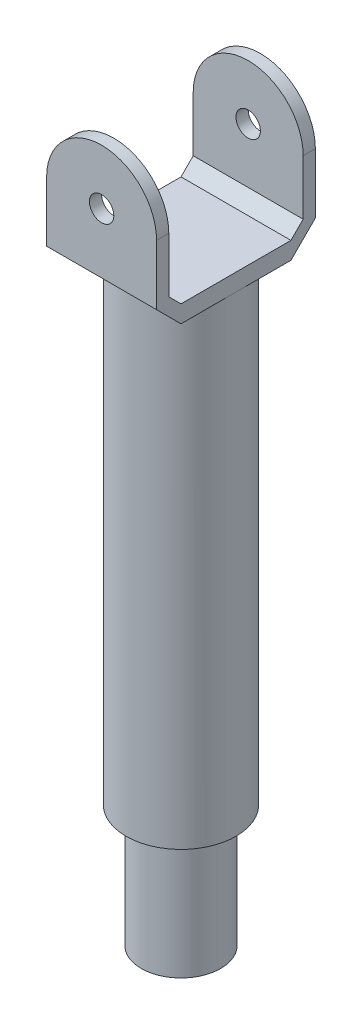
ISO-10303-21;
HEADER;
FILE_DESCRIPTION(('STEP AP214'),'2;1');
FILE_NAME('part.step','',(''),(''),'','','');
FILE_SCHEMA(('AUTOMOTIVE_DESIGN { 1 0 10303 214 1 1 1 1 }'));
ENDSEC;
DATA;
#1=APPLICATION_CONTEXT('core data for automotive mechanical design processes');
#2=APPLICATION_PROTOCOL_DEFINITION('international standard','automotive_design',2000,#1);
#3=PRODUCT_CONTEXT('',#1,'mechanical');
#4=PRODUCT('Part','Part','',(#3));
#5=PRODUCT_RELATED_PRODUCT_CATEGORY('part','',(#4));
#6=PRODUCT_DEFINITION_FORMATION('','',#4);
#7=PRODUCT_DEFINITION_CONTEXT('part definition',#1,'design');
#8=PRODUCT_DEFINITION('design','',#6,#7);
#9=PRODUCT_DEFINITION_SHAPE('','',#8);
#10=(LENGTH_UNIT() NAMED_UNIT(*) SI_UNIT(.MILLI.,.METRE.));
#11=(NAMED_UNIT(*) PLANE_ANGLE_UNIT() SI_UNIT($,.RADIAN.));
#12=(NAMED_UNIT(*) SI_UNIT($,.STERADIAN.) SOLID_ANGLE_UNIT());
#13=UNCERTAINTY_MEASURE_WITH_UNIT(LENGTH_MEASURE(1.E-05),#10,'distance_accuracy_value','');
#14=(GEOMETRIC_REPRESENTATION_CONTEXT(3) GLOBAL_UNCERTAINTY_ASSIGNED_CONTEXT((#13)) GLOBAL_UNIT_ASSIGNED_CONTEXT((#10,
#11,#12)) REPRESENTATION_CONTEXT('',''));
#15=CARTESIAN_POINT('',(0.,0.,0.));
#16=DIRECTION('',(0.,0.,1.));
#17=DIRECTION('',(1.,0.,0.));
#18=AXIS2_PLACEMENT_3D('',#15,#16,#17);
#19=CARTESIAN_POINT('',(45.,0.,0.));
#20=DIRECTION('',(-1.,0.,0.));
#21=DIRECTION('',(0.,0.,1.));
#22=AXIS2_PLACEMENT_3D('',#19,#20,#21);
#23=PLANE('',#22);
#24=DIRECTION('',(0.,0.,1.));
#25=VECTOR('',#24,1.);
#26=CARTESIAN_POINT('',(45.,555.,-64.9999999999999));
#27=LINE('',#26,#25);
#28=CARTESIAN_POINT('',(45.,555.,55.));
#29=VERTEX_POINT('',#28);
#30=CARTESIAN_POINT('',(45.,555.,64.9999999999998));
#31=VERTEX_POINT('',#30);
#32=EDGE_CURVE('E273',#29,#31,#27,.T.);
#33=ORIENTED_EDGE('',*,*,#32,.T.);
#34=DIRECTION('',(0.,-1.,0.));
#35=VECTOR('',#34,1.);
#36=CARTESIAN_POINT('',(45.,600.,65.));
#37=LINE('',#36,#35);
#38=CARTESIAN_POINT('',(45.,505.857864376269,65.));
#39=VERTEX_POINT('',#38);
#40=EDGE_CURVE('E43',#31,#39,#37,.T.);
#41=ORIENTED_EDGE('',*,*,#40,.T.);
#42=DIRECTION('',(0.,-0.707106781186543,-0.707106781186552));
#43=VECTOR('',#42,1.);
#44=CARTESIAN_POINT('',(45.,505.857864376269,65.));
#45=LINE('',#44,#43);
#46=CARTESIAN_POINT('',(45.,485.857864376269,45.));
#47=VERTEX_POINT('',#46);
#48=EDGE_CURVE('E326',#39,#47,#45,.T.);
#49=ORIENTED_EDGE('',*,*,#48,.T.);
#50=DIRECTION('',(0.,0.,-1.));
#51=VECTOR('',#50,1.);
#52=CARTESIAN_POINT('',(45.,485.857864376269,45.));
#53=LINE('',#52,#51);
#54=CARTESIAN_POINT('',(45.,485.857864376269,0.));
#55=VERTEX_POINT('',#54);
#56=EDGE_CURVE('E334',#47,#55,#53,.T.);
#57=ORIENTED_EDGE('',*,*,#56,.T.);
#58=CARTESIAN_POINT('',(45.,485.857864376269,-45.));
#59=VERTEX_POINT('',#58);
#60=EDGE_CURVE('E333',#55,#59,#53,.T.);
#61=ORIENTED_EDGE('',*,*,#60,.T.);
#62=DIRECTION('',(0.,0.707106781186548,-0.707106781186546));
#63=VECTOR('',#62,1.);
#64=CARTESIAN_POINT('',(45.,485.857864376269,-45.));
#65=LINE('',#64,#63);
#66=CARTESIAN_POINT('',(45.,505.857864376269,-64.9999999999999));
#67=VERTEX_POINT('',#66);
#68=EDGE_CURVE('E301',#59,#67,#65,.T.);
#69=ORIENTED_EDGE('',*,*,#68,.T.);
#70=DIRECTION('',(0.,1.,0.));
#71=VECTOR('',#70,1.);
#72=CARTESIAN_POINT('',(45.,505.857864376269,-64.9999999999999));
#73=LINE('',#72,#71);
#74=CARTESIAN_POINT('',(45.,555.,-64.9999999999999));
#75=VERTEX_POINT('',#74);
#76=EDGE_CURVE('E290',#67,#75,#73,.T.);
#77=ORIENTED_EDGE('',*,*,#76,.T.);
#78=CARTESIAN_POINT('',(45.,555.,-55.));
#79=VERTEX_POINT('',#78);
#80=EDGE_CURVE('E152',#75,#79,#27,.T.);
#81=ORIENTED_EDGE('',*,*,#80,.T.);
#82=DIRECTION('',(0.,-1.,0.));
#83=VECTOR('',#82,1.);
#84=CARTESIAN_POINT('',(45.,600.,-55.));
#85=LINE('',#84,#83);
#86=CARTESIAN_POINT('',(45.,510.,-55.));
#87=VERTEX_POINT('',#86);
#88=EDGE_CURVE('E287',#79,#87,#85,.T.);
#89=ORIENTED_EDGE('',*,*,#88,.T.);
#90=DIRECTION('',(0.,-0.707106781186549,0.707106781186546));
#91=VECTOR('',#90,1.);
#92=CARTESIAN_POINT('',(45.,510.,-55.));
#93=LINE('',#92,#91);
#94=CARTESIAN_POINT('',(45.,500.,-45.));
#95=VERTEX_POINT('',#94);
#96=EDGE_CURVE('E204',#87,#95,#93,.T.);
#97=ORIENTED_EDGE('',*,*,#96,.T.);
#98=DIRECTION('',(0.,0.,1.));
#99=VECTOR('',#98,1.);
#100=CARTESIAN_POINT('',(45.,500.,-45.));
#101=LINE('',#100,#99);
#102=CARTESIAN_POINT('',(45.,500.,45.));
#103=VERTEX_POINT('',#102);
#104=EDGE_CURVE('E199',#95,#103,#101,.T.);
#105=ORIENTED_EDGE('',*,*,#104,.T.);
#106=DIRECTION('',(0.,0.707106781186548,0.707106781186547));
#107=VECTOR('',#106,1.);
#108=CARTESIAN_POINT('',(45.,500.,45.));
#109=LINE('',#108,#107);
#110=CARTESIAN_POINT('',(45.,510.,55.));
#111=VERTEX_POINT('',#110);
#112=EDGE_CURVE('E322',#103,#111,#109,.T.);
#113=ORIENTED_EDGE('',*,*,#112,.T.);
#114=DIRECTION('',(0.,1.,0.));
#115=VECTOR('',#114,1.);
#116=CARTESIAN_POINT('',(45.,510.,55.));
#117=LINE('',#116,#115);
#118=EDGE_CURVE('E320',#111,#29,#117,.T.);
#119=ORIENTED_EDGE('',*,*,#118,.T.);
#120=EDGE_LOOP('',(#33,#41,#49,#57,#61,#69,#77,#81,#89,#97,#105,#113,#119));
#121=FACE_BOUND('',#120,.T.);
#122=ADVANCED_FACE('F39',(#121),#23,.F.);
#123=CARTESIAN_POINT('',(-45.,0.,0.));
#124=DIRECTION('',(-1.,0.,0.));
#125=DIRECTION('',(0.,0.,1.));
#126=AXIS2_PLACEMENT_3D('',#123,#124,#125);
#127=PLANE('',#126);
#128=DIRECTION('',(0.,-1.,0.));
#129=VECTOR('',#128,1.);
#130=CARTESIAN_POINT('',(-45.,600.,65.));
#131=LINE('',#130,#129);
#132=CARTESIAN_POINT('',(-45.,555.,65.0000059999998));
#133=VERTEX_POINT('',#132);
#134=CARTESIAN_POINT('',(-45.,505.857864376269,65.));
#135=VERTEX_POINT('',#134);
#136=EDGE_CURVE('E158',#133,#135,#131,.T.);
#137=ORIENTED_EDGE('',*,*,#136,.F.);
#138=DIRECTION('',(0.,0.,1.));
#139=VECTOR('',#138,1.);
#140=CARTESIAN_POINT('',(-45.,555.,-64.9999999999999));
#141=LINE('',#140,#139);
#142=CARTESIAN_POINT('',(-45.,555.,55.));
#143=VERTEX_POINT('',#142);
#144=EDGE_CURVE('E139',#143,#133,#141,.T.);
#145=ORIENTED_EDGE('',*,*,#144,.F.);
#146=DIRECTION('',(0.,1.,0.));
#147=VECTOR('',#146,1.);
#148=CARTESIAN_POINT('',(-45.,510.,55.));
#149=LINE('',#148,#147);
#150=CARTESIAN_POINT('',(-45.,510.,55.));
#151=VERTEX_POINT('',#150);
#152=EDGE_CURVE('E169',#151,#143,#149,.T.);
#153=ORIENTED_EDGE('',*,*,#152,.F.);
#154=DIRECTION('',(0.,0.707106781186548,0.707106781186547));
#155=VECTOR('',#154,1.);
#156=CARTESIAN_POINT('',(-45.,500.,45.));
#157=LINE('',#156,#155);
#158=CARTESIAN_POINT('',(-45.,500.,45.));
#159=VERTEX_POINT('',#158);
#160=EDGE_CURVE('E174',#159,#151,#157,.T.);
#161=ORIENTED_EDGE('',*,*,#160,.F.);
#162=DIRECTION('',(0.,0.,1.));
#163=VECTOR('',#162,1.);
#164=CARTESIAN_POINT('',(-45.,500.,-45.));
#165=LINE('',#164,#163);
#166=CARTESIAN_POINT('',(-45.,500.,-45.));
#167=VERTEX_POINT('',#166);
#168=EDGE_CURVE('E305',#167,#159,#165,.T.);
#169=ORIENTED_EDGE('',*,*,#168,.F.);
#170=DIRECTION('',(0.,-0.707106781186549,0.707106781186546));
#171=VECTOR('',#170,1.);
#172=CARTESIAN_POINT('',(-45.,510.,-55.));
#173=LINE('',#172,#171);
#174=CARTESIAN_POINT('',(-45.,510.,-55.));
#175=VERTEX_POINT('',#174);
#176=EDGE_CURVE('E195',#175,#167,#173,.T.);
#177=ORIENTED_EDGE('',*,*,#176,.F.);
#178=DIRECTION('',(0.,-1.,0.));
#179=VECTOR('',#178,1.);
#180=CARTESIAN_POINT('',(-45.,600.,-55.));
#181=LINE('',#180,#179);
#182=CARTESIAN_POINT('',(-45.,555.,-55.));
#183=VERTEX_POINT('',#182);
#184=EDGE_CURVE('E192',#183,#175,#181,.T.);
#185=ORIENTED_EDGE('',*,*,#184,.F.);
#186=CARTESIAN_POINT('',(-45.,555.,-64.9999999999999));
#187=VERTEX_POINT('',#186);
#188=EDGE_CURVE('E151',#187,#183,#141,.T.);
#189=ORIENTED_EDGE('',*,*,#188,.F.);
#190=DIRECTION('',(0.,1.,0.));
#191=VECTOR('',#190,1.);
#192=CARTESIAN_POINT('',(-45.,505.857864376269,-64.9999999999999));
#193=LINE('',#192,#191);
#194=CARTESIAN_POINT('',(-45.,505.857864376269,-64.9999999999999));
#195=VERTEX_POINT('',#194);
#196=EDGE_CURVE('E188',#195,#187,#193,.T.);
#197=ORIENTED_EDGE('',*,*,#196,.F.);
#198=DIRECTION('',(0.,0.707106781186548,-0.707106781186546));
#199=VECTOR('',#198,1.);
#200=CARTESIAN_POINT('',(-45.,485.857864376269,-45.));
#201=LINE('',#200,#199);
#202=CARTESIAN_POINT('',(-45.,485.857864376269,-45.));
#203=VERTEX_POINT('',#202);
#204=EDGE_CURVE('E185',#203,#195,#201,.T.);
#205=ORIENTED_EDGE('',*,*,#204,.F.);
#206=DIRECTION('',(0.,0.,-1.));
#207=VECTOR('',#206,1.);
#208=CARTESIAN_POINT('',(-45.,485.857864376269,45.));
#209=LINE('',#208,#207);
#210=CARTESIAN_POINT('',(-45.,485.857864376269,0.));
#211=VERTEX_POINT('',#210);
#212=EDGE_CURVE('E172',#211,#203,#209,.T.);
#213=ORIENTED_EDGE('',*,*,#212,.F.);
#214=CARTESIAN_POINT('',(-45.,485.857864376269,45.));
#215=VERTEX_POINT('',#214);
#216=EDGE_CURVE('E181',#215,#211,#209,.T.);
#217=ORIENTED_EDGE('',*,*,#216,.F.);
#218=DIRECTION('',(0.,-0.707106781186543,-0.707106781186552));
#219=VECTOR('',#218,1.);
#220=CARTESIAN_POINT('',(-45.,505.857864376269,65.));
#221=LINE('',#220,#219);
#222=EDGE_CURVE('E167',#135,#215,#221,.T.);
#223=ORIENTED_EDGE('',*,*,#222,.F.);
#224=EDGE_LOOP('',(#137,#145,#153,#161,#169,#177,#185,#189,#197,#205,#213,#217,#223));
#225=FACE_BOUND('',#224,.T.);
#226=ADVANCED_FACE('F164',(#225),#127,.T.);
#227=CARTESIAN_POINT('',(0.,500.,0.));
#228=DIRECTION('',(0.,-1.,0.));
#229=DIRECTION('',(0.,0.,-1.));
#230=AXIS2_PLACEMENT_3D('',#227,#228,#229);
#231=CYLINDRICAL_SURFACE('',#230,45.);
#232=CARTESIAN_POINT('',(0.,100.,0.));
#233=DIRECTION('',(0.,1.,0.));
#234=DIRECTION('',(0.,0.,1.));
#235=AXIS2_PLACEMENT_3D('',#232,#233,#234);
#236=CIRCLE('',#235,45.);
#237=CARTESIAN_POINT('',(0.,100.,45.));
#238=VERTEX_POINT('',#237);
#239=EDGE_CURVE('E232',#238,#238,#236,.T.);
#240=ORIENTED_EDGE('',*,*,#239,.T.);
#241=EDGE_LOOP('',(#240));
#242=FACE_BOUND('',#241,.T.);
#243=CARTESIAN_POINT('',(0.,485.857864376269,0.));
#244=DIRECTION('',(0.,1.,0.));
#245=DIRECTION('',(0.,0.,1.));
#246=AXIS2_PLACEMENT_3D('',#243,#244,#245);
#247=CIRCLE('',#246,45.);
#248=CARTESIAN_POINT('',(0.,485.857864376269,-45.));
#249=VERTEX_POINT('',#248);
#250=EDGE_CURVE('E50',#55,#249,#247,.T.);
#251=ORIENTED_EDGE('',*,*,#250,.F.);
#252=CARTESIAN_POINT('',(0.,485.857864376269,45.));
#253=VERTEX_POINT('',#252);
#254=EDGE_CURVE('E247',#253,#55,#247,.T.);
#255=ORIENTED_EDGE('',*,*,#254,.F.);
#256=EDGE_CURVE('E241',#211,#253,#247,.T.);
#257=ORIENTED_EDGE('',*,*,#256,.F.);
#258=EDGE_CURVE('E58',#249,#211,#247,.T.);
#259=ORIENTED_EDGE('',*,*,#258,.F.);
#260=EDGE_LOOP('',(#251,#255,#257,#259));
#261=FACE_BOUND('',#260,.T.);
#262=ADVANCED_FACE('F378',(#242,#261),#231,.T.);
#263=CARTESIAN_POINT('',(0.,100.,0.));
#264=DIRECTION('',(0.,-1.,0.));
#265=DIRECTION('',(0.,0.,-1.));
#266=AXIS2_PLACEMENT_3D('',#263,#264,#265);
#267=CYLINDRICAL_SURFACE('',#266,32.5);
#268=CARTESIAN_POINT('',(0.,100.,0.));
#269=DIRECTION('',(0.,1.,0.));
#270=DIRECTION('',(0.,0.,1.));
#271=AXIS2_PLACEMENT_3D('',#268,#269,#270);
#272=CIRCLE('',#271,32.5);
#273=CARTESIAN_POINT('',(0.,100.,32.5));
#274=VERTEX_POINT('',#273);
#275=EDGE_CURVE('E237',#274,#274,#272,.T.);
#276=ORIENTED_EDGE('',*,*,#275,.F.);
#277=EDGE_LOOP('',(#276));
#278=FACE_BOUND('',#277,.T.);
#279=CARTESIAN_POINT('',(0.,0.,0.));
#280=DIRECTION('',(0.,1.,0.));
#281=DIRECTION('',(0.,0.,1.));
#282=AXIS2_PLACEMENT_3D('',#279,#280,#281);
#283=CIRCLE('',#282,32.5);
#284=CARTESIAN_POINT('',(0.,0.,32.5));
#285=VERTEX_POINT('',#284);
#286=EDGE_CURVE('E236',#285,#285,#283,.T.);
#287=ORIENTED_EDGE('',*,*,#286,.T.);
#288=EDGE_LOOP('',(#287));
#289=FACE_BOUND('',#288,.T.);
#290=ADVANCED_FACE('F41',(#278,#289),#267,.T.);
#291=CARTESIAN_POINT('',(0.,0.,0.));
#292=DIRECTION('',(0.,1.,0.));
#293=DIRECTION('',(0.,0.,1.));
#294=AXIS2_PLACEMENT_3D('',#291,#292,#293);
#295=PLANE('',#294);
#296=ORIENTED_EDGE('',*,*,#286,.F.);
#297=EDGE_LOOP('',(#296));
#298=FACE_BOUND('',#297,.T.);
#299=ADVANCED_FACE('F433',(#298),#295,.F.);
#300=CARTESIAN_POINT('',(0.,100.,0.));
#301=DIRECTION('',(0.,1.,0.));
#302=DIRECTION('',(0.,0.,1.));
#303=AXIS2_PLACEMENT_3D('',#300,#301,#302);
#304=PLANE('',#303);
#305=ORIENTED_EDGE('',*,*,#275,.T.);
#306=EDGE_LOOP('',(#305));
#307=FACE_BOUND('',#306,.T.);
#308=ORIENTED_EDGE('',*,*,#239,.F.);
#309=EDGE_LOOP('',(#308));
#310=FACE_BOUND('',#309,.T.);
#311=ADVANCED_FACE('F435',(#307,#310),#304,.F.);
#312=CARTESIAN_POINT('',(45.,485.857864376269,45.));
#313=DIRECTION('',(0.,1.,0.));
#314=DIRECTION('',(0.,0.,1.));
#315=AXIS2_PLACEMENT_3D('',#312,#313,#314);
#316=PLANE('',#315);
#317=DIRECTION('',(-1.,0.,0.));
#318=VECTOR('',#317,1.);
#319=CARTESIAN_POINT('',(45.,485.857864376269,45.));
#320=LINE('',#319,#318);
#321=EDGE_CURVE('E218',#47,#253,#320,.T.);
#322=ORIENTED_EDGE('',*,*,#321,.T.);
#323=ORIENTED_EDGE('',*,*,#254,.T.);
#324=ORIENTED_EDGE('',*,*,#56,.F.);
#325=EDGE_LOOP('',(#322,#323,#324));
#326=FACE_BOUND('',#325,.T.);
#327=ADVANCED_FACE('F393',(#326),#316,.F.);
#328=ORIENTED_EDGE('',*,*,#60,.F.);
#329=ORIENTED_EDGE('',*,*,#250,.T.);
#330=DIRECTION('',(-1.,0.,0.));
#331=VECTOR('',#330,1.);
#332=CARTESIAN_POINT('',(45.,485.857864376269,-45.));
#333=LINE('',#332,#331);
#334=EDGE_CURVE('E213',#59,#249,#333,.T.);
#335=ORIENTED_EDGE('',*,*,#334,.F.);
#336=EDGE_LOOP('',(#328,#329,#335));
#337=FACE_BOUND('',#336,.T.);
#338=ADVANCED_FACE('F407',(#337),#316,.F.);
#339=EDGE_CURVE('E212',#249,#203,#333,.T.);
#340=ORIENTED_EDGE('',*,*,#339,.F.);
#341=ORIENTED_EDGE('',*,*,#258,.T.);
#342=ORIENTED_EDGE('',*,*,#212,.T.);
#343=EDGE_LOOP('',(#340,#341,#342));
#344=FACE_BOUND('',#343,.T.);
#345=ADVANCED_FACE('F394',(#344),#316,.F.);
#346=CARTESIAN_POINT('',(45.,500.,45.));
#347=DIRECTION('',(0.,-0.707106781186547,0.707106781186548));
#348=DIRECTION('',(0.,-0.707106781186548,-0.707106781186547));
#349=AXIS2_PLACEMENT_3D('',#346,#347,#348);
#350=PLANE('',#349);
#351=ORIENTED_EDGE('',*,*,#160,.T.);
#352=DIRECTION('',(-1.,0.,0.));
#353=VECTOR('',#352,1.);
#354=CARTESIAN_POINT('',(45.,510.,55.));
#355=LINE('',#354,#353);
#356=EDGE_CURVE('E225',#111,#151,#355,.T.);
#357=ORIENTED_EDGE('',*,*,#356,.F.);
#358=ORIENTED_EDGE('',*,*,#112,.F.);
#359=DIRECTION('',(-1.,0.,0.));
#360=VECTOR('',#359,1.);
#361=CARTESIAN_POINT('',(45.,500.,45.));
#362=LINE('',#361,#360);
#363=EDGE_CURVE('E229',#103,#159,#362,.T.);
#364=ORIENTED_EDGE('',*,*,#363,.T.);
#365=EDGE_LOOP('',(#351,#357,#358,#364));
#366=FACE_BOUND('',#365,.T.);
#367=ADVANCED_FACE('F312',(#366),#350,.F.);
#368=CARTESIAN_POINT('',(45.,510.,55.));
#369=DIRECTION('',(0.,0.,1.));
#370=DIRECTION('',(1.,0.,0.));
#371=AXIS2_PLACEMENT_3D('',#368,#369,#370);
#372=PLANE('',#371);
#373=CARTESIAN_POINT('',(0.,555.,55.));
#374=DIRECTION('',(0.,0.,1.));
#375=DIRECTION('',(1.,0.,0.));
#376=AXIS2_PLACEMENT_3D('',#373,#374,#375);
#377=CIRCLE('',#376,10.);
#378=CARTESIAN_POINT('',(10.,555.,55.));
#379=VERTEX_POINT('',#378);
#380=EDGE_CURVE('E161',#379,#379,#377,.T.);
#381=ORIENTED_EDGE('',*,*,#380,.T.);
#382=EDGE_LOOP('',(#381));
#383=FACE_BOUND('',#382,.T.);
#384=ORIENTED_EDGE('',*,*,#152,.T.);
#385=CARTESIAN_POINT('',(0.,555.,55.));
#386=DIRECTION('',(0.,0.,1.));
#387=DIRECTION('',(1.,0.,0.));
#388=AXIS2_PLACEMENT_3D('',#385,#386,#387);
#389=CIRCLE('',#388,45.);
#390=EDGE_CURVE('E145',#143,#29,#389,.F.);
#391=ORIENTED_EDGE('',*,*,#390,.T.);
#392=ORIENTED_EDGE('',*,*,#118,.F.);
#393=ORIENTED_EDGE('',*,*,#356,.T.);
#394=EDGE_LOOP('',(#384,#391,#392,#393));
#395=FACE_BOUND('',#394,.T.);
#396=ADVANCED_FACE('F318',(#383,#395),#372,.F.);
#397=CARTESIAN_POINT('',(45.,600.,65.));
#398=DIRECTION('',(0.,0.,-1.));
#399=DIRECTION('',(0.,1.,0.));
#400=AXIS2_PLACEMENT_3D('',#397,#398,#399);
#401=PLANE('',#400);
#402=CARTESIAN_POINT('',(0.,555.,65.));
#403=DIRECTION('',(0.,0.,-1.));
#404=DIRECTION('',(0.,1.,0.));
#405=AXIS2_PLACEMENT_3D('',#402,#403,#404);
#406=CIRCLE('',#405,10.);
#407=CARTESIAN_POINT('',(10.,555.,65.));
#408=VERTEX_POINT('',#407);
#409=EDGE_CURVE('E251',#408,#408,#406,.T.);
#410=ORIENTED_EDGE('',*,*,#409,.T.);
#411=EDGE_LOOP('',(#410));
#412=FACE_BOUND('',#411,.T.);
#413=ORIENTED_EDGE('',*,*,#40,.F.);
#414=CARTESIAN_POINT('',(0.,555.,65.));
#415=DIRECTION('',(0.,0.,-1.));
#416=DIRECTION('',(0.,1.,0.));
#417=AXIS2_PLACEMENT_3D('',#414,#415,#416);
#418=CIRCLE('',#417,45.);
#419=EDGE_CURVE('E143',#31,#133,#418,.F.);
#420=ORIENTED_EDGE('',*,*,#419,.T.);
#421=ORIENTED_EDGE('',*,*,#136,.T.);
#422=DIRECTION('',(-1.,0.,0.));
#423=VECTOR('',#422,1.);
#424=CARTESIAN_POINT('',(45.,505.857864376269,65.));
#425=LINE('',#424,#423);
#426=EDGE_CURVE('E222',#39,#135,#425,.T.);
#427=ORIENTED_EDGE('',*,*,#426,.F.);
#428=EDGE_LOOP('',(#413,#420,#421,#427));
#429=FACE_BOUND('',#428,.T.);
#430=ADVANCED_FACE('F156',(#412,#429),#401,.F.);
#431=CARTESIAN_POINT('',(45.,505.857864376269,65.));
#432=DIRECTION('',(0.,0.707106781186552,-0.707106781186543));
#433=DIRECTION('',(0.,0.707106781186543,0.707106781186552));
#434=AXIS2_PLACEMENT_3D('',#431,#432,#433);
#435=PLANE('',#434);
#436=ORIENTED_EDGE('',*,*,#222,.T.);
#437=EDGE_CURVE('E217',#253,#215,#320,.T.);
#438=ORIENTED_EDGE('',*,*,#437,.F.);
#439=ORIENTED_EDGE('',*,*,#321,.F.);
#440=ORIENTED_EDGE('',*,*,#48,.F.);
#441=ORIENTED_EDGE('',*,*,#426,.T.);
#442=EDGE_LOOP('',(#436,#438,#439,#440,#441));
#443=FACE_BOUND('',#442,.T.);
#444=ADVANCED_FACE('F391',(#443),#435,.F.);
#445=ORIENTED_EDGE('',*,*,#216,.T.);
#446=ORIENTED_EDGE('',*,*,#256,.T.);
#447=ORIENTED_EDGE('',*,*,#437,.T.);
#448=EDGE_LOOP('',(#445,#446,#447));
#449=FACE_BOUND('',#448,.T.);
#450=ADVANCED_FACE('F388',(#449),#316,.F.);
#451=CARTESIAN_POINT('',(45.,485.857864376269,-45.));
#452=DIRECTION('',(0.,0.707106781186546,0.707106781186548));
#453=DIRECTION('',(0.,-0.707106781186549,0.707106781186547));
#454=AXIS2_PLACEMENT_3D('',#451,#452,#453);
#455=PLANE('',#454);
#456=ORIENTED_EDGE('',*,*,#204,.T.);
#457=DIRECTION('',(-1.,0.,0.));
#458=VECTOR('',#457,1.);
#459=CARTESIAN_POINT('',(45.,505.857864376269,-64.9999999999999));
#460=LINE('',#459,#458);
#461=EDGE_CURVE('E208',#67,#195,#460,.T.);
#462=ORIENTED_EDGE('',*,*,#461,.F.);
#463=ORIENTED_EDGE('',*,*,#68,.F.);
#464=ORIENTED_EDGE('',*,*,#334,.T.);
#465=ORIENTED_EDGE('',*,*,#339,.T.);
#466=EDGE_LOOP('',(#456,#462,#463,#464,#465));
#467=FACE_BOUND('',#466,.T.);
#468=ADVANCED_FACE('F343',(#467),#455,.F.);
#469=CARTESIAN_POINT('',(45.,505.857864376269,-64.9999999999999));
#470=DIRECTION('',(0.,0.,1.));
#471=DIRECTION('',(1.,0.,0.));
#472=AXIS2_PLACEMENT_3D('',#469,#470,#471);
#473=PLANE('',#472);
#474=CARTESIAN_POINT('',(0.,555.,-64.9999999999999));
#475=DIRECTION('',(0.,0.,1.));
#476=DIRECTION('',(1.,0.,0.));
#477=AXIS2_PLACEMENT_3D('',#474,#475,#476);
#478=CIRCLE('',#477,10.);
#479=CARTESIAN_POINT('',(10.,555.,-64.9999999999999));
#480=VERTEX_POINT('',#479);
#481=EDGE_CURVE('E252',#480,#480,#478,.T.);
#482=ORIENTED_EDGE('',*,*,#481,.T.);
#483=EDGE_LOOP('',(#482));
#484=FACE_BOUND('',#483,.T.);
#485=ORIENTED_EDGE('',*,*,#196,.T.);
#486=CARTESIAN_POINT('',(0.,555.,-64.9999999999999));
#487=DIRECTION('',(0.,0.,-1.));
#488=DIRECTION('',(1.,0.,0.));
#489=AXIS2_PLACEMENT_3D('',#486,#487,#488);
#490=CIRCLE('',#489,45.);
#491=EDGE_CURVE('E275',#187,#75,#490,.T.);
#492=ORIENTED_EDGE('',*,*,#491,.T.);
#493=ORIENTED_EDGE('',*,*,#76,.F.);
#494=ORIENTED_EDGE('',*,*,#461,.T.);
#495=EDGE_LOOP('',(#485,#492,#493,#494));
#496=FACE_BOUND('',#495,.T.);
#497=ADVANCED_FACE('F347',(#484,#496),#473,.F.);
#498=CARTESIAN_POINT('',(45.,600.,-55.));
#499=DIRECTION('',(0.,0.,-1.));
#500=DIRECTION('',(0.,1.,0.));
#501=AXIS2_PLACEMENT_3D('',#498,#499,#500);
#502=PLANE('',#501);
#503=CARTESIAN_POINT('',(0.,555.,-55.));
#504=DIRECTION('',(0.,0.,-1.));
#505=DIRECTION('',(0.,1.,0.));
#506=AXIS2_PLACEMENT_3D('',#503,#504,#505);
#507=CIRCLE('',#506,10.);
#508=CARTESIAN_POINT('',(0.,565.,-55.));
#509=VERTEX_POINT('',#508);
#510=EDGE_CURVE('E248',#509,#509,#507,.T.);
#511=ORIENTED_EDGE('',*,*,#510,.T.);
#512=EDGE_LOOP('',(#511));
#513=FACE_BOUND('',#512,.T.);
#514=CARTESIAN_POINT('',(0.,555.,-55.));
#515=DIRECTION('',(0.,0.,-1.));
#516=DIRECTION('',(0.,1.,0.));
#517=AXIS2_PLACEMENT_3D('',#514,#515,#516);
#518=CIRCLE('',#517,45.);
#519=EDGE_CURVE('E11',#79,#183,#518,.F.);
#520=ORIENTED_EDGE('',*,*,#519,.T.);
#521=ORIENTED_EDGE('',*,*,#184,.T.);
#522=DIRECTION('',(-1.,0.,0.));
#523=VECTOR('',#522,1.);
#524=CARTESIAN_POINT('',(45.,510.,-55.));
#525=LINE('',#524,#523);
#526=EDGE_CURVE('E203',#87,#175,#525,.T.);
#527=ORIENTED_EDGE('',*,*,#526,.F.);
#528=ORIENTED_EDGE('',*,*,#88,.F.);
#529=EDGE_LOOP('',(#520,#521,#527,#528));
#530=FACE_BOUND('',#529,.T.);
#531=ADVANCED_FACE('F294',(#513,#530),#502,.F.);
#532=CARTESIAN_POINT('',(45.,510.,-55.));
#533=DIRECTION('',(0.,-0.707106781186546,-0.707106781186549));
#534=DIRECTION('',(0.,0.707106781186549,-0.707106781186546));
#535=AXIS2_PLACEMENT_3D('',#532,#533,#534);
#536=PLANE('',#535);
#537=ORIENTED_EDGE('',*,*,#176,.T.);
#538=DIRECTION('',(-1.,0.,0.));
#539=VECTOR('',#538,1.);
#540=CARTESIAN_POINT('',(45.,500.,-45.));
#541=LINE('',#540,#539);
#542=EDGE_CURVE('E200',#95,#167,#541,.T.);
#543=ORIENTED_EDGE('',*,*,#542,.F.);
#544=ORIENTED_EDGE('',*,*,#96,.F.);
#545=ORIENTED_EDGE('',*,*,#526,.T.);
#546=EDGE_LOOP('',(#537,#543,#544,#545));
#547=FACE_BOUND('',#546,.T.);
#548=ADVANCED_FACE('F354',(#547),#536,.F.);
#549=CARTESIAN_POINT('',(0.,500.,0.));
#550=DIRECTION('',(0.,1.,0.));
#551=DIRECTION('',(0.,0.,1.));
#552=AXIS2_PLACEMENT_3D('',#549,#550,#551);
#553=PLANE('',#552);
#554=ORIENTED_EDGE('',*,*,#168,.T.);
#555=ORIENTED_EDGE('',*,*,#363,.F.);
#556=ORIENTED_EDGE('',*,*,#104,.F.);
#557=ORIENTED_EDGE('',*,*,#542,.T.);
#558=EDGE_LOOP('',(#554,#555,#556,#557));
#559=FACE_BOUND('',#558,.T.);
#560=ADVANCED_FACE('F359',(#559),#553,.T.);
#561=CARTESIAN_POINT('',(0.,555.,-64.9999999999999));
#562=DIRECTION('',(0.,0.,1.));
#563=DIRECTION('',(1.,0.,0.));
#564=AXIS2_PLACEMENT_3D('',#561,#562,#563);
#565=CYLINDRICAL_SURFACE('',#564,10.);
#566=ORIENTED_EDGE('',*,*,#481,.F.);
#567=EDGE_LOOP('',(#566));
#568=FACE_BOUND('',#567,.T.);
#569=ORIENTED_EDGE('',*,*,#510,.F.);
#570=EDGE_LOOP('',(#569));
#571=FACE_BOUND('',#570,.T.);
#572=ADVANCED_FACE('F361',(#568,#571),#565,.F.);
#573=CARTESIAN_POINT('',(0.,555.,-64.9999999999999));
#574=DIRECTION('',(0.,0.,1.));
#575=DIRECTION('',(1.,0.,0.));
#576=AXIS2_PLACEMENT_3D('',#573,#574,#575);
#577=CYLINDRICAL_SURFACE('',#576,45.);
#578=ORIENTED_EDGE('',*,*,#519,.F.);
#579=ORIENTED_EDGE('',*,*,#80,.F.);
#580=ORIENTED_EDGE('',*,*,#491,.F.);
#581=ORIENTED_EDGE('',*,*,#188,.T.);
#582=EDGE_LOOP('',(#578,#579,#580,#581));
#583=FACE_BOUND('',#582,.T.);
#584=ADVANCED_FACE('F350',(#583),#577,.T.);
#585=CARTESIAN_POINT('',(10.,555.,65.));
#586=CARTESIAN_POINT('',(10.,555.,64.8958333333333));
#587=CARTESIAN_POINT('',(10.,555.,64.7916666666667));
#588=CARTESIAN_POINT('',(10.,555.,64.5833333333333));
#589=CARTESIAN_POINT('',(10.,555.,64.4791666666667));
#590=CARTESIAN_POINT('',(10.,555.,64.2708333333333));
#591=CARTESIAN_POINT('',(10.,555.,64.1666666666667));
#592=CARTESIAN_POINT('',(10.,555.,63.9583333333333));
#593=CARTESIAN_POINT('',(10.,555.,63.8541666666667));
#594=CARTESIAN_POINT('',(10.,555.,63.6458333333333));
#595=CARTESIAN_POINT('',(10.,555.,63.5416666666667));
#596=CARTESIAN_POINT('',(10.,555.,63.3333333333333));
#597=CARTESIAN_POINT('',(10.,555.,63.2291666666667));
#598=CARTESIAN_POINT('',(10.,555.,63.0208333333333));
#599=CARTESIAN_POINT('',(10.,555.,62.9166666666667));
#600=CARTESIAN_POINT('',(10.,555.,62.7083333333333));
#601=CARTESIAN_POINT('',(10.,555.,62.6041666666667));
#602=CARTESIAN_POINT('',(10.,555.,62.3958333333333));
#603=CARTESIAN_POINT('',(10.,555.,62.2916666666667));
#604=CARTESIAN_POINT('',(10.,555.,62.0833333333333));
#605=CARTESIAN_POINT('',(10.,555.,61.9791666666667));
#606=CARTESIAN_POINT('',(10.,555.,61.7708333333333));
#607=CARTESIAN_POINT('',(10.,555.,61.6666666666667));
#608=CARTESIAN_POINT('',(10.,555.,61.4583333333333));
#609=CARTESIAN_POINT('',(10.,555.,61.3541666666667));
#610=CARTESIAN_POINT('',(10.,555.,61.1458333333333));
#611=CARTESIAN_POINT('',(10.,555.,61.0416666666667));
#612=CARTESIAN_POINT('',(10.,555.,60.8333333333333));
#613=CARTESIAN_POINT('',(10.,555.,60.7291666666667));
#614=CARTESIAN_POINT('',(10.,555.,60.5208333333333));
#615=CARTESIAN_POINT('',(10.,555.,60.4166666666667));
#616=CARTESIAN_POINT('',(10.,555.,60.2083333333333));
#617=CARTESIAN_POINT('',(10.,555.,60.1041666666667));
#618=CARTESIAN_POINT('',(10.,555.,59.8958333333333));
#619=CARTESIAN_POINT('',(10.,555.,59.7916666666667));
#620=CARTESIAN_POINT('',(10.,555.,59.5833333333333));
#621=CARTESIAN_POINT('',(10.,555.,59.4791666666667));
#622=CARTESIAN_POINT('',(10.,555.,59.2708333333333));
#623=CARTESIAN_POINT('',(10.,555.,59.1666666666667));
#624=CARTESIAN_POINT('',(10.,555.,58.9583333333333));
#625=CARTESIAN_POINT('',(10.,555.,58.8541666666667));
#626=CARTESIAN_POINT('',(10.,555.,58.6458333333333));
#627=CARTESIAN_POINT('',(10.,555.,58.5416666666667));
#628=CARTESIAN_POINT('',(10.,555.,58.3333333333333));
#629=CARTESIAN_POINT('',(10.,555.,58.2291666666667));
#630=CARTESIAN_POINT('',(10.,555.,58.0208333333333));
#631=CARTESIAN_POINT('',(10.,555.,57.9166666666667));
#632=CARTESIAN_POINT('',(10.,555.,57.7083333333333));
#633=CARTESIAN_POINT('',(10.,555.,57.6041666666667));
#634=CARTESIAN_POINT('',(10.,555.,57.3958333333333));
#635=CARTESIAN_POINT('',(10.,555.,57.2916666666667));
#636=CARTESIAN_POINT('',(10.,555.,57.0833333333333));
#637=CARTESIAN_POINT('',(10.,555.,56.9791666666667));
#638=CARTESIAN_POINT('',(10.,555.,56.7708333333333));
#639=CARTESIAN_POINT('',(10.,555.,56.6666666666667));
#640=CARTESIAN_POINT('',(10.,555.,56.4583333333333));
#641=CARTESIAN_POINT('',(10.,555.,56.3541666666667));
#642=CARTESIAN_POINT('',(10.,555.,56.1458333333333));
#643=CARTESIAN_POINT('',(10.,555.,56.0416666666667));
#644=CARTESIAN_POINT('',(10.,555.,55.8333333333333));
#645=CARTESIAN_POINT('',(10.,555.,55.7291666666667));
#646=CARTESIAN_POINT('',(10.,555.,55.5208333333333));
#647=CARTESIAN_POINT('',(10.,555.,55.4166666666667));
#648=CARTESIAN_POINT('',(10.,555.,55.2083333333333));
#649=CARTESIAN_POINT('',(10.,555.,55.1041666666667));
#650=CARTESIAN_POINT('',(10.,555.,55.));
#651=B_SPLINE_CURVE_WITH_KNOTS('',3,(#585,#586,#587,#588,#589,#590,#591,#592,#593,#594,#595,
#596,#597,#598,#599,#600,#601,#602,#603,#604,#605,#606,#607,#608,#609,#610,#611,#612,#613,#614,
#615,#616,#617,#618,#619,#620,#621,#622,#623,#624,#625,#626,#627,#628,#629,#630,#631,#632,#633,
#634,#635,#636,#637,#638,#639,#640,#641,#642,#643,#644,#645,#646,#647,#648,#649,#650),
.UNSPECIFIED.,.F.,.F.,(4,2,2,2,2,2,2,2,2,2,2,2,2,2,2,2,2,2,2,2,2,2,2,2,2,2,2,2,2,2,2,2,4),(0.,
0.312499999999993,0.624999999999987,0.937500000000008,1.25,1.56249999999999,1.87500000000002,
2.18750000000001,2.5,2.8125,3.12499999999999,3.43750000000001,3.75,4.0625,4.37500000000002,
4.68750000000001,5.,5.3125,5.62500000000001,5.93750000000001,6.25000000000001,6.5625,
6.87500000000001,7.18750000000001,7.50000000000001,7.8125,8.12500000000001,8.43750000000001,
8.75000000000001,9.0625,9.37500000000001,9.68750000000002,10.),.UNSPECIFIED.);
#652=EDGE_CURVE('BSEAM369',#408,#379,#651,.T.);
#653=ORIENTED_EDGE('',*,*,#409,.F.);
#654=ORIENTED_EDGE('',*,*,#380,.F.);
#655=ORIENTED_EDGE('',*,*,#652,.T.);
#656=ORIENTED_EDGE('',*,*,#652,.F.);
#657=EDGE_LOOP('',(#653,#655,#654,#656));
#658=FACE_BOUND('',#657,.T.);
#659=ADVANCED_FACE('F369',(#658),#565,.F.);
#660=ORIENTED_EDGE('',*,*,#144,.T.);
#661=ORIENTED_EDGE('',*,*,#419,.F.);
#662=ORIENTED_EDGE('',*,*,#32,.F.);
#663=ORIENTED_EDGE('',*,*,#390,.F.);
#664=EDGE_LOOP('',(#660,#661,#662,#663));
#665=FACE_BOUND('',#664,.T.);
#666=ADVANCED_FACE('F141',(#665),#577,.T.);
#667=CLOSED_SHELL('',(#122,#226,#262,#290,#299,#311,#327,#338,#345,#367,#396,#430,#444,#450,
#468,#497,#531,#548,#560,#572,#584,#659,#666));
#668=MANIFOLD_SOLID_BREP('B2',#667);
#669=ADVANCED_BREP_SHAPE_REPRESENTATION('',(#18,#668),#14);
#670=SHAPE_DEFINITION_REPRESENTATION(#9,#669);
ENDSEC;
END-ISO-10303-21;
